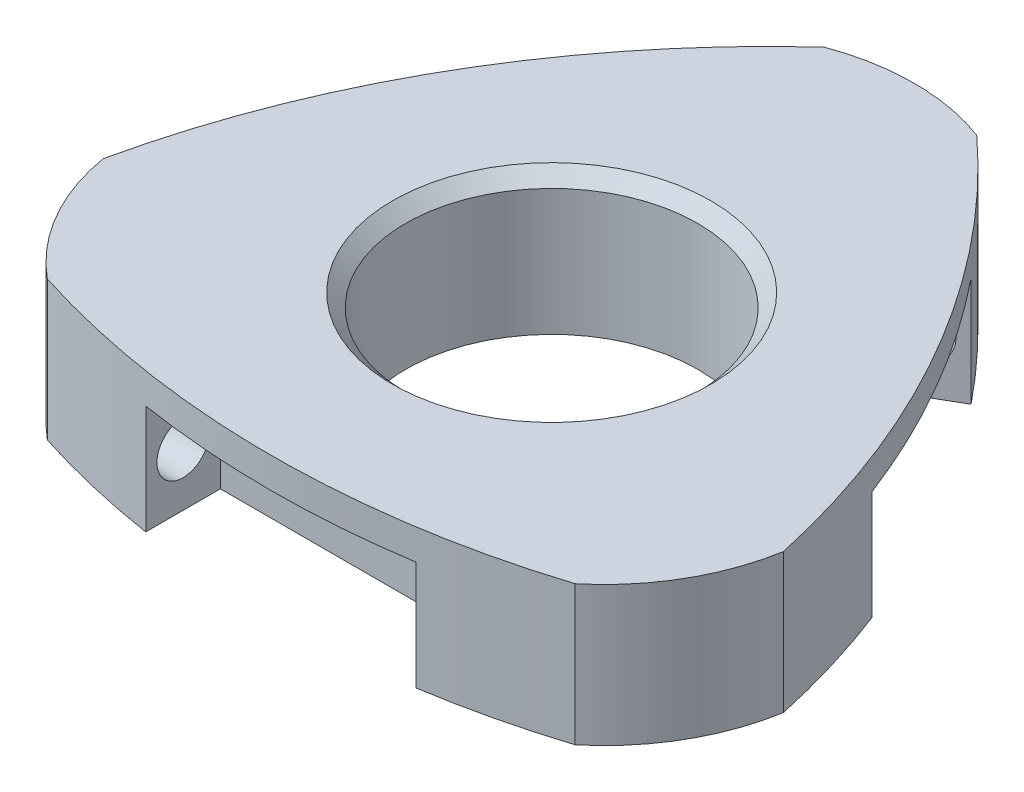
ISO-10303-21;
HEADER;
FILE_DESCRIPTION(('STEP AP214'),'2;1');
FILE_NAME('part.step','',(''),(''),'','','');
FILE_SCHEMA(('AUTOMOTIVE_DESIGN { 1 0 10303 214 1 1 1 1 }'));
ENDSEC;
DATA;
#1=APPLICATION_CONTEXT('core data for automotive mechanical design processes');
#2=APPLICATION_PROTOCOL_DEFINITION('international standard','automotive_design',2000,#1);
#3=PRODUCT_CONTEXT('',#1,'mechanical');
#4=PRODUCT('Part','Part','',(#3));
#5=PRODUCT_RELATED_PRODUCT_CATEGORY('part','',(#4));
#6=PRODUCT_DEFINITION_FORMATION('','',#4);
#7=PRODUCT_DEFINITION_CONTEXT('part definition',#1,'design');
#8=PRODUCT_DEFINITION('design','',#6,#7);
#9=PRODUCT_DEFINITION_SHAPE('','',#8);
#10=(LENGTH_UNIT() NAMED_UNIT(*) SI_UNIT(.MILLI.,.METRE.));
#11=(NAMED_UNIT(*) PLANE_ANGLE_UNIT() SI_UNIT($,.RADIAN.));
#12=(NAMED_UNIT(*) SI_UNIT($,.STERADIAN.) SOLID_ANGLE_UNIT());
#13=UNCERTAINTY_MEASURE_WITH_UNIT(LENGTH_MEASURE(1.E-05),#10,'distance_accuracy_value','');
#14=(GEOMETRIC_REPRESENTATION_CONTEXT(3) GLOBAL_UNCERTAINTY_ASSIGNED_CONTEXT((#13)) GLOBAL_UNIT_ASSIGNED_CONTEXT((#10,
#11,#12)) REPRESENTATION_CONTEXT('',''));
#15=CARTESIAN_POINT('',(0.,0.,0.));
#16=DIRECTION('',(0.,0.,1.));
#17=DIRECTION('',(1.,0.,0.));
#18=AXIS2_PLACEMENT_3D('',#15,#16,#17);
#19=CARTESIAN_POINT('',(-58.6577467048848,32.,17.2848083441158));
#20=DIRECTION('',(0.,-1.,0.));
#21=DIRECTION('',(0.,0.,-1.));
#22=AXIS2_PLACEMENT_3D('',#19,#20,#21);
#23=PLANE('',#22);
#24=CARTESIAN_POINT('',(0.,32.,0.));
#25=DIRECTION('',(0.,-1.,0.));
#26=DIRECTION('',(0.,0.,-1.));
#27=AXIS2_PLACEMENT_3D('',#24,#25,#26);
#28=CIRCLE('',#27,36.5000000000001);
#29=CARTESIAN_POINT('',(0.,32.,-36.5000000000001));
#30=VERTEX_POINT('',#29);
#31=EDGE_CURVE('E294',#30,#30,#28,.T.);
#32=ORIENTED_EDGE('',*,*,#31,.T.);
#33=EDGE_LOOP('',(#32));
#34=FACE_BOUND('',#33,.T.);
#35=CARTESIAN_POINT('',(0.,32.,-33.1625150120123));
#36=DIRECTION('',(0.,1.,0.));
#37=DIRECTION('',(0.,0.,-1.));
#38=AXIS2_PLACEMENT_3D('',#35,#36,#37);
#39=CIRCLE('',#38,49.9999999999997);
#40=CARTESIAN_POINT('',(17.5,32.,-80.));
#41=VERTEX_POINT('',#40);
#42=CARTESIAN_POINT('',(-17.5000000000001,32.,-80.));
#43=VERTEX_POINT('',#42);
#44=EDGE_CURVE('E242',#41,#43,#39,.T.);
#45=ORIENTED_EDGE('',*,*,#44,.T.);
#46=CARTESIAN_POINT('',(117.315493409728,32.,67.7321317002211));
#47=DIRECTION('',(0.,1.,0.));
#48=DIRECTION('',(0.,0.,-1.));
#49=AXIS2_PLACEMENT_3D('',#46,#47,#48);
#50=CIRCLE('',#49,200.);
#51=CARTESIAN_POINT('',(-78.0320323027553,32.,24.8445554337716));
#52=VERTEX_POINT('',#51);
#53=EDGE_CURVE('E245',#43,#52,#50,.T.);
#54=ORIENTED_EDGE('',*,*,#53,.T.);
#55=CARTESIAN_POINT('',(-28.7195804537838,32.,16.5812575060049));
#56=DIRECTION('',(0.,1.,0.));
#57=DIRECTION('',(0.,0.,-1.));
#58=AXIS2_PLACEMENT_3D('',#55,#56,#57);
#59=CIRCLE('',#58,50.0000000000017);
#60=CARTESIAN_POINT('',(-60.5320323027555,32.,55.1554445662271));
#61=VERTEX_POINT('',#60);
#62=EDGE_CURVE('E248',#52,#61,#59,.T.);
#63=ORIENTED_EDGE('',*,*,#62,.T.);
#64=CARTESIAN_POINT('',(9.64996423005846E-13,32.,-135.464263400484));
#65=DIRECTION('',(0.,1.,0.));
#66=DIRECTION('',(0.,0.,-1.));
#67=AXIS2_PLACEMENT_3D('',#64,#65,#66);
#68=CIRCLE('',#67,200.00000000004);
#69=CARTESIAN_POINT('',(60.5320323027548,32.,55.155444566228));
#70=VERTEX_POINT('',#69);
#71=EDGE_CURVE('E250',#61,#70,#68,.T.);
#72=ORIENTED_EDGE('',*,*,#71,.T.);
#73=CARTESIAN_POINT('',(28.7195804537851,32.,16.5812575060061));
#74=DIRECTION('',(0.,1.,0.));
#75=DIRECTION('',(0.,0.,-1.));
#76=AXIS2_PLACEMENT_3D('',#73,#74,#75);
#77=CIRCLE('',#76,50.);
#78=CARTESIAN_POINT('',(78.032032302755,32.,24.8445554337727));
#79=VERTEX_POINT('',#78);
#80=EDGE_CURVE('E252',#70,#79,#77,.T.);
#81=ORIENTED_EDGE('',*,*,#80,.T.);
#82=CARTESIAN_POINT('',(-117.31549340977,32.,67.7321317002439));
#83=DIRECTION('',(0.,1.,0.));
#84=DIRECTION('',(0.,0.,-1.));
#85=AXIS2_PLACEMENT_3D('',#82,#83,#84);
#86=CIRCLE('',#85,200.000000000045);
#87=EDGE_CURVE('E254',#79,#41,#86,.T.);
#88=ORIENTED_EDGE('',*,*,#87,.T.);
#89=EDGE_LOOP('',(#45,#54,#63,#72,#81,#88));
#90=FACE_BOUND('',#89,.T.);
#91=ADVANCED_FACE('F34',(#34,#90),#23,.F.);
#92=CARTESIAN_POINT('',(-58.6577467048848,0.,17.2848083441158));
#93=DIRECTION('',(0.,-1.,0.));
#94=DIRECTION('',(0.,0.,-1.));
#95=AXIS2_PLACEMENT_3D('',#92,#93,#94);
#96=PLANE('',#95);
#97=DIRECTION('',(-0.866025403784436,0.,-0.500000000000004));
#98=VECTOR('',#97,1.);
#99=CARTESIAN_POINT('',(-54.4711431702998,0.,4.34678751731735));
#100=LINE('',#99,#98);
#101=CARTESIAN_POINT('',(-54.4711431702998,0.,4.34678751731735));
#102=VERTEX_POINT('',#101);
#103=CARTESIAN_POINT('',(-69.2963121444177,0.,-4.21252778067141));
#104=VERTEX_POINT('',#103);
#105=EDGE_CURVE('E185',#102,#104,#100,.T.);
#106=ORIENTED_EDGE('',*,*,#105,.F.);
#107=DIRECTION('',(-0.500000000000004,0.,0.866025403784436));
#108=VECTOR('',#107,1.);
#109=CARTESIAN_POINT('',(-23.4711431702995,0.,-49.3467875173177));
#110=LINE('',#109,#108);
#111=CARTESIAN_POINT('',(-23.4711431702995,0.,-49.3467875173177));
#112=VERTEX_POINT('',#111);
#113=EDGE_CURVE('E189',#112,#102,#110,.T.);
#114=ORIENTED_EDGE('',*,*,#113,.F.);
#115=DIRECTION('',(0.866025403784436,0.,0.500000000000004));
#116=VECTOR('',#115,1.);
#117=CARTESIAN_POINT('',(-23.4711431702995,0.,-49.3467875173177));
#118=LINE('',#117,#116);
#119=CARTESIAN_POINT('',(-38.2963121444174,0.,-57.9061028153065));
#120=VERTEX_POINT('',#119);
#121=EDGE_CURVE('E175',#120,#112,#118,.T.);
#122=ORIENTED_EDGE('',*,*,#121,.F.);
#123=CARTESIAN_POINT('',(117.315493409728,0.,67.7321317002211));
#124=DIRECTION('',(0.,1.,0.));
#125=DIRECTION('',(0.,0.,-1.));
#126=AXIS2_PLACEMENT_3D('',#123,#124,#125);
#127=CIRCLE('',#126,200.);
#128=CARTESIAN_POINT('',(-17.5000000000001,0.,-80.));
#129=VERTEX_POINT('',#128);
#130=EDGE_CURVE('E260',#129,#120,#127,.T.);
#131=ORIENTED_EDGE('',*,*,#130,.F.);
#132=CARTESIAN_POINT('',(0.,0.,-33.1625150120123));
#133=DIRECTION('',(0.,1.,0.));
#134=DIRECTION('',(0.,0.,-1.));
#135=AXIS2_PLACEMENT_3D('',#132,#133,#134);
#136=CIRCLE('',#135,49.9999999999997);
#137=CARTESIAN_POINT('',(17.5,0.,-80.));
#138=VERTEX_POINT('',#137);
#139=EDGE_CURVE('E241',#138,#129,#136,.T.);
#140=ORIENTED_EDGE('',*,*,#139,.F.);
#141=CARTESIAN_POINT('',(-117.31549340977,0.,67.7321317002439));
#142=DIRECTION('',(0.,1.,0.));
#143=DIRECTION('',(0.,0.,-1.));
#144=AXIS2_PLACEMENT_3D('',#141,#142,#143);
#145=CIRCLE('',#144,200.000000000045);
#146=CARTESIAN_POINT('',(38.2963121444164,0.,-57.9061028153049));
#147=VERTEX_POINT('',#146);
#148=EDGE_CURVE('E271',#147,#138,#145,.T.);
#149=ORIENTED_EDGE('',*,*,#148,.F.);
#150=DIRECTION('',(0.866025403784443,0.,-0.499999999999992));
#151=VECTOR('',#150,1.);
#152=CARTESIAN_POINT('',(23.4711431703002,0.,-49.3467875173174));
#153=LINE('',#152,#151);
#154=CARTESIAN_POINT('',(23.4711431703002,0.,-49.3467875173174));
#155=VERTEX_POINT('',#154);
#156=EDGE_CURVE('E200',#155,#147,#153,.T.);
#157=ORIENTED_EDGE('',*,*,#156,.F.);
#158=DIRECTION('',(-0.499999999999992,0.,-0.866025403784443));
#159=VECTOR('',#158,1.);
#160=CARTESIAN_POINT('',(54.4711431702997,0.,4.34678751731811));
#161=LINE('',#160,#159);
#162=CARTESIAN_POINT('',(54.4711431702997,0.,4.34678751731811));
#163=VERTEX_POINT('',#162);
#164=EDGE_CURVE('E195',#163,#155,#161,.T.);
#165=ORIENTED_EDGE('',*,*,#164,.F.);
#166=DIRECTION('',(-0.866025403784443,0.,0.499999999999992));
#167=VECTOR('',#166,1.);
#168=CARTESIAN_POINT('',(54.4711431702997,0.,4.34678751731811));
#169=LINE('',#168,#167);
#170=CARTESIAN_POINT('',(69.2963121444162,0.,-4.21252778066954));
#171=VERTEX_POINT('',#170);
#172=EDGE_CURVE('E202',#171,#163,#169,.T.);
#173=ORIENTED_EDGE('',*,*,#172,.F.);
#174=CARTESIAN_POINT('',(78.032032302755,0.,24.8445554337727));
#175=VERTEX_POINT('',#174);
#176=EDGE_CURVE('E246',#175,#171,#145,.T.);
#177=ORIENTED_EDGE('',*,*,#176,.F.);
#178=CARTESIAN_POINT('',(28.7195804537851,0.,16.5812575060061));
#179=DIRECTION('',(0.,1.,0.));
#180=DIRECTION('',(0.,0.,-1.));
#181=AXIS2_PLACEMENT_3D('',#178,#179,#180);
#182=CIRCLE('',#181,50.);
#183=CARTESIAN_POINT('',(60.5320323027548,0.,55.155444566228));
#184=VERTEX_POINT('',#183);
#185=EDGE_CURVE('E269',#184,#175,#182,.T.);
#186=ORIENTED_EDGE('',*,*,#185,.F.);
#187=CARTESIAN_POINT('',(9.64996423005846E-13,0.,-135.464263400484));
#188=DIRECTION('',(0.,1.,0.));
#189=DIRECTION('',(0.,0.,-1.));
#190=AXIS2_PLACEMENT_3D('',#187,#188,#189);
#191=CIRCLE('',#190,200.00000000004);
#192=CARTESIAN_POINT('',(31.,0.,62.1186305959758));
#193=VERTEX_POINT('',#192);
#194=EDGE_CURVE('E265',#193,#184,#191,.T.);
#195=ORIENTED_EDGE('',*,*,#194,.F.);
#196=DIRECTION('',(0.,0.,1.));
#197=VECTOR('',#196,1.);
#198=CARTESIAN_POINT('',(31.,0.,45.));
#199=LINE('',#198,#197);
#200=CARTESIAN_POINT('',(31.,0.,45.));
#201=VERTEX_POINT('',#200);
#202=EDGE_CURVE('E219',#201,#193,#199,.T.);
#203=ORIENTED_EDGE('',*,*,#202,.F.);
#204=DIRECTION('',(1.,0.,0.));
#205=VECTOR('',#204,1.);
#206=CARTESIAN_POINT('',(-31.,0.,45.));
#207=LINE('',#206,#205);
#208=CARTESIAN_POINT('',(-31.,0.,45.));
#209=VERTEX_POINT('',#208);
#210=EDGE_CURVE('E223',#209,#201,#207,.T.);
#211=ORIENTED_EDGE('',*,*,#210,.F.);
#212=DIRECTION('',(0.,0.,-1.));
#213=VECTOR('',#212,1.);
#214=CARTESIAN_POINT('',(-31.,0.,45.));
#215=LINE('',#214,#213);
#216=CARTESIAN_POINT('',(-31.,0.,62.1186305959755));
#217=VERTEX_POINT('',#216);
#218=EDGE_CURVE('E230',#217,#209,#215,.T.);
#219=ORIENTED_EDGE('',*,*,#218,.F.);
#220=CARTESIAN_POINT('',(-60.5320323027555,0.,55.1554445662271));
#221=VERTEX_POINT('',#220);
#222=EDGE_CURVE('E266',#221,#217,#191,.T.);
#223=ORIENTED_EDGE('',*,*,#222,.F.);
#224=CARTESIAN_POINT('',(-28.7195804537838,0.,16.5812575060049));
#225=DIRECTION('',(0.,1.,0.));
#226=DIRECTION('',(0.,0.,-1.));
#227=AXIS2_PLACEMENT_3D('',#224,#225,#226);
#228=CIRCLE('',#227,50.0000000000017);
#229=CARTESIAN_POINT('',(-78.0320323027553,0.,24.8445554337716));
#230=VERTEX_POINT('',#229);
#231=EDGE_CURVE('E263',#230,#221,#228,.T.);
#232=ORIENTED_EDGE('',*,*,#231,.F.);
#233=EDGE_CURVE('E259',#104,#230,#127,.T.);
#234=ORIENTED_EDGE('',*,*,#233,.F.);
#235=EDGE_LOOP('',(#106,#114,#122,#131,#140,#149,#157,#165,#173,#177,#186,#195,#203,#211,#219,
#223,#232,#234));
#236=FACE_BOUND('',#235,.T.);
#237=CARTESIAN_POINT('',(0.,0.,0.));
#238=DIRECTION('',(0.,1.,0.));
#239=DIRECTION('',(0.,0.,1.));
#240=AXIS2_PLACEMENT_3D('',#237,#238,#239);
#241=CIRCLE('',#240,33.5);
#242=CARTESIAN_POINT('',(0.,0.,33.5));
#243=VERTEX_POINT('',#242);
#244=EDGE_CURVE('E236',#243,#243,#241,.T.);
#245=ORIENTED_EDGE('',*,*,#244,.T.);
#246=EDGE_LOOP('',(#245));
#247=FACE_BOUND('',#246,.T.);
#248=ADVANCED_FACE('F365',(#236,#247),#96,.T.);
#249=CARTESIAN_POINT('',(0.,32.,-33.1625150120123));
#250=DIRECTION('',(0.,-1.,0.));
#251=DIRECTION('',(0.,0.,-1.));
#252=AXIS2_PLACEMENT_3D('',#249,#250,#251);
#253=CYLINDRICAL_SURFACE('',#252,49.9999999999997);
#254=ORIENTED_EDGE('',*,*,#139,.T.);
#255=DIRECTION('',(0.,-1.,0.));
#256=VECTOR('',#255,1.);
#257=CARTESIAN_POINT('',(-17.5000000000001,32.,-80.));
#258=LINE('',#257,#256);
#259=EDGE_CURVE('E288',#43,#129,#258,.T.);
#260=ORIENTED_EDGE('',*,*,#259,.F.);
#261=ORIENTED_EDGE('',*,*,#44,.F.);
#262=DIRECTION('',(0.,-1.,0.));
#263=VECTOR('',#262,1.);
#264=CARTESIAN_POINT('',(17.5,32.,-80.));
#265=LINE('',#264,#263);
#266=EDGE_CURVE('E256',#41,#138,#265,.T.);
#267=ORIENTED_EDGE('',*,*,#266,.T.);
#268=EDGE_LOOP('',(#254,#260,#261,#267));
#269=FACE_BOUND('',#268,.T.);
#270=ADVANCED_FACE('F387',(#269),#253,.T.);
#271=CARTESIAN_POINT('',(117.315493409728,32.,67.7321317002211));
#272=DIRECTION('',(0.,-1.,0.));
#273=DIRECTION('',(0.,0.,-1.));
#274=AXIS2_PLACEMENT_3D('',#271,#272,#273);
#275=CYLINDRICAL_SURFACE('',#274,200.);
#276=CARTESIAN_POINT('',(117.315493409728,25.,67.7321317002211));
#277=DIRECTION('',(0.,1.,0.));
#278=DIRECTION('',(0.,0.,1.));
#279=AXIS2_PLACEMENT_3D('',#276,#277,#278);
#280=CIRCLE('',#279,200.);
#281=CARTESIAN_POINT('',(-38.2963121444174,25.,-57.9061028153065));
#282=VERTEX_POINT('',#281);
#283=CARTESIAN_POINT('',(-69.2963121444177,25.,-4.21252778067141));
#284=VERTEX_POINT('',#283);
#285=EDGE_CURVE('E167',#282,#284,#280,.T.);
#286=ORIENTED_EDGE('',*,*,#285,.T.);
#287=DIRECTION('',(0.,-1.,0.));
#288=VECTOR('',#287,1.);
#289=CARTESIAN_POINT('',(-69.2963121444177,32.,-4.21252778067141));
#290=LINE('',#289,#288);
#291=EDGE_CURVE('E11',#284,#104,#290,.T.);
#292=ORIENTED_EDGE('',*,*,#291,.T.);
#293=ORIENTED_EDGE('',*,*,#233,.T.);
#294=DIRECTION('',(0.,-1.,0.));
#295=VECTOR('',#294,1.);
#296=CARTESIAN_POINT('',(-78.0320323027553,32.,24.8445554337716));
#297=LINE('',#296,#295);
#298=EDGE_CURVE('E285',#52,#230,#297,.T.);
#299=ORIENTED_EDGE('',*,*,#298,.F.);
#300=ORIENTED_EDGE('',*,*,#53,.F.);
#301=ORIENTED_EDGE('',*,*,#259,.T.);
#302=ORIENTED_EDGE('',*,*,#130,.T.);
#303=DIRECTION('',(0.,-1.,0.));
#304=VECTOR('',#303,1.);
#305=CARTESIAN_POINT('',(-38.2963121444174,32.,-57.9061028153065));
#306=LINE('',#305,#304);
#307=EDGE_CURVE('E43',#120,#282,#306,.F.);
#308=ORIENTED_EDGE('',*,*,#307,.T.);
#309=EDGE_LOOP('',(#286,#292,#293,#299,#300,#301,#302,#308));
#310=FACE_BOUND('',#309,.T.);
#311=ADVANCED_FACE('F407',(#310),#275,.T.);
#312=CARTESIAN_POINT('',(-28.7195804537838,32.,16.5812575060049));
#313=DIRECTION('',(0.,-1.,0.));
#314=DIRECTION('',(0.,0.,-1.));
#315=AXIS2_PLACEMENT_3D('',#312,#313,#314);
#316=CYLINDRICAL_SURFACE('',#315,50.0000000000017);
#317=ORIENTED_EDGE('',*,*,#231,.T.);
#318=DIRECTION('',(0.,-1.,0.));
#319=VECTOR('',#318,1.);
#320=CARTESIAN_POINT('',(-60.5320323027555,32.,55.1554445662271));
#321=LINE('',#320,#319);
#322=EDGE_CURVE('E282',#61,#221,#321,.T.);
#323=ORIENTED_EDGE('',*,*,#322,.F.);
#324=ORIENTED_EDGE('',*,*,#62,.F.);
#325=ORIENTED_EDGE('',*,*,#298,.T.);
#326=EDGE_LOOP('',(#317,#323,#324,#325));
#327=FACE_BOUND('',#326,.T.);
#328=ADVANCED_FACE('F403',(#327),#316,.T.);
#329=CARTESIAN_POINT('',(9.64996423005846E-13,32.,-135.464263400484));
#330=DIRECTION('',(0.,-1.,0.));
#331=DIRECTION('',(0.,0.,-1.));
#332=AXIS2_PLACEMENT_3D('',#329,#330,#331);
#333=CYLINDRICAL_SURFACE('',#332,200.00000000004);
#334=CARTESIAN_POINT('',(9.64996423005846E-13,25.,-135.464263400484));
#335=DIRECTION('',(0.,1.,0.));
#336=DIRECTION('',(0.,0.,1.));
#337=AXIS2_PLACEMENT_3D('',#334,#335,#336);
#338=CIRCLE('',#337,200.00000000004);
#339=CARTESIAN_POINT('',(-31.,25.,62.1186305959755));
#340=VERTEX_POINT('',#339);
#341=CARTESIAN_POINT('',(31.,25.,62.1186305959758));
#342=VERTEX_POINT('',#341);
#343=EDGE_CURVE('E297',#340,#342,#338,.T.);
#344=ORIENTED_EDGE('',*,*,#343,.T.);
#345=DIRECTION('',(0.,-1.,0.));
#346=VECTOR('',#345,1.);
#347=CARTESIAN_POINT('',(31.,32.,62.1186305959758));
#348=LINE('',#347,#346);
#349=EDGE_CURVE('E303',#342,#193,#348,.T.);
#350=ORIENTED_EDGE('',*,*,#349,.T.);
#351=ORIENTED_EDGE('',*,*,#194,.T.);
#352=DIRECTION('',(0.,-1.,0.));
#353=VECTOR('',#352,1.);
#354=CARTESIAN_POINT('',(60.5320323027548,32.,55.155444566228));
#355=LINE('',#354,#353);
#356=EDGE_CURVE('E279',#70,#184,#355,.T.);
#357=ORIENTED_EDGE('',*,*,#356,.F.);
#358=ORIENTED_EDGE('',*,*,#71,.F.);
#359=ORIENTED_EDGE('',*,*,#322,.T.);
#360=ORIENTED_EDGE('',*,*,#222,.T.);
#361=DIRECTION('',(0.,-1.,0.));
#362=VECTOR('',#361,1.);
#363=CARTESIAN_POINT('',(-31.,32.,62.1186305959755));
#364=LINE('',#363,#362);
#365=EDGE_CURVE('E300',#217,#340,#364,.F.);
#366=ORIENTED_EDGE('',*,*,#365,.T.);
#367=EDGE_LOOP('',(#344,#350,#351,#357,#358,#359,#360,#366));
#368=FACE_BOUND('',#367,.T.);
#369=ADVANCED_FACE('F399',(#368),#333,.T.);
#370=CARTESIAN_POINT('',(28.7195804537851,32.,16.5812575060061));
#371=DIRECTION('',(0.,-1.,0.));
#372=DIRECTION('',(0.,0.,-1.));
#373=AXIS2_PLACEMENT_3D('',#370,#371,#372);
#374=CYLINDRICAL_SURFACE('',#373,50.);
#375=ORIENTED_EDGE('',*,*,#185,.T.);
#376=DIRECTION('',(0.,-1.,0.));
#377=VECTOR('',#376,1.);
#378=CARTESIAN_POINT('',(78.032032302755,32.,24.8445554337727));
#379=LINE('',#378,#377);
#380=EDGE_CURVE('E276',#79,#175,#379,.T.);
#381=ORIENTED_EDGE('',*,*,#380,.F.);
#382=ORIENTED_EDGE('',*,*,#80,.F.);
#383=ORIENTED_EDGE('',*,*,#356,.T.);
#384=EDGE_LOOP('',(#375,#381,#382,#383));
#385=FACE_BOUND('',#384,.T.);
#386=ADVANCED_FACE('F396',(#385),#374,.T.);
#387=CARTESIAN_POINT('',(-117.31549340977,32.,67.7321317002439));
#388=DIRECTION('',(0.,-1.,0.));
#389=DIRECTION('',(0.,0.,-1.));
#390=AXIS2_PLACEMENT_3D('',#387,#388,#389);
#391=CYLINDRICAL_SURFACE('',#390,200.000000000045);
#392=CARTESIAN_POINT('',(-117.31549340977,25.,67.7321317002439));
#393=DIRECTION('',(0.,1.,0.));
#394=DIRECTION('',(0.,0.,1.));
#395=AXIS2_PLACEMENT_3D('',#392,#393,#394);
#396=CIRCLE('',#395,200.000000000045);
#397=CARTESIAN_POINT('',(69.2963121444162,25.,-4.21252778066954));
#398=VERTEX_POINT('',#397);
#399=CARTESIAN_POINT('',(38.2963121444164,25.,-57.9061028153049));
#400=VERTEX_POINT('',#399);
#401=EDGE_CURVE('E306',#398,#400,#396,.T.);
#402=ORIENTED_EDGE('',*,*,#401,.T.);
#403=DIRECTION('',(0.,-1.,0.));
#404=VECTOR('',#403,1.);
#405=CARTESIAN_POINT('',(38.2963121444164,32.,-57.9061028153049));
#406=LINE('',#405,#404);
#407=EDGE_CURVE('E314',#400,#147,#406,.T.);
#408=ORIENTED_EDGE('',*,*,#407,.T.);
#409=ORIENTED_EDGE('',*,*,#148,.T.);
#410=ORIENTED_EDGE('',*,*,#266,.F.);
#411=ORIENTED_EDGE('',*,*,#87,.F.);
#412=ORIENTED_EDGE('',*,*,#380,.T.);
#413=ORIENTED_EDGE('',*,*,#176,.T.);
#414=DIRECTION('',(0.,-1.,0.));
#415=VECTOR('',#414,1.);
#416=CARTESIAN_POINT('',(69.2963121444162,32.,-4.21252778066955));
#417=LINE('',#416,#415);
#418=EDGE_CURVE('E311',#171,#398,#417,.F.);
#419=ORIENTED_EDGE('',*,*,#418,.T.);
#420=EDGE_LOOP('',(#402,#408,#409,#410,#411,#412,#413,#419));
#421=FACE_BOUND('',#420,.T.);
#422=ADVANCED_FACE('F371',(#421),#391,.T.);
#423=CARTESIAN_POINT('',(0.,32.,0.));
#424=DIRECTION('',(0.,-1.,0.));
#425=DIRECTION('',(0.,0.,-1.));
#426=AXIS2_PLACEMENT_3D('',#423,#424,#425);
#427=CYLINDRICAL_SURFACE('',#426,33.5);
#428=CARTESIAN_POINT('',(0.,28.9999999999999,0.));
#429=DIRECTION('',(0.,-1.,0.));
#430=DIRECTION('',(0.,0.,-1.));
#431=AXIS2_PLACEMENT_3D('',#428,#429,#430);
#432=CIRCLE('',#431,33.5);
#433=CARTESIAN_POINT('',(0.,28.9999999999999,-33.5));
#434=VERTEX_POINT('',#433);
#435=EDGE_CURVE('E291',#434,#434,#432,.F.);
#436=ORIENTED_EDGE('',*,*,#435,.T.);
#437=EDGE_LOOP('',(#436));
#438=FACE_BOUND('',#437,.T.);
#439=ORIENTED_EDGE('',*,*,#244,.F.);
#440=EDGE_LOOP('',(#439));
#441=FACE_BOUND('',#440,.T.);
#442=ADVANCED_FACE('F391',(#438,#441),#427,.F.);
#443=CARTESIAN_POINT('',(0.,28.9999999999999,0.));
#444=DIRECTION('',(0.,1.,0.));
#445=DIRECTION('',(0.,0.,1.));
#446=AXIS2_PLACEMENT_3D('',#443,#444,#445);
#447=CONICAL_SURFACE('',#446,33.5,0.785398163397453);
#448=ORIENTED_EDGE('',*,*,#31,.F.);
#449=EDGE_LOOP('',(#448));
#450=FACE_BOUND('',#449,.T.);
#451=ORIENTED_EDGE('',*,*,#435,.F.);
#452=EDGE_LOOP('',(#451));
#453=FACE_BOUND('',#452,.T.);
#454=ADVANCED_FACE('F36',(#450,#453),#447,.F.);
#455=CARTESIAN_POINT('',(31.,25.,45.));
#456=DIRECTION('',(1.,0.,0.));
#457=DIRECTION('',(0.,0.,-1.));
#458=AXIS2_PLACEMENT_3D('',#455,#456,#457);
#459=PLANE('',#458);
#460=CARTESIAN_POINT('',(31.,12.5,53.5593152979879));
#461=DIRECTION('',(1.,0.,0.));
#462=DIRECTION('',(0.,0.,-1.));
#463=AXIS2_PLACEMENT_3D('',#460,#461,#462);
#464=CIRCLE('',#463,5.99999999999999);
#465=CARTESIAN_POINT('',(31.,12.5,47.5593152979879));
#466=VERTEX_POINT('',#465);
#467=EDGE_CURVE('E216',#466,#466,#464,.F.);
#468=ORIENTED_EDGE('',*,*,#467,.F.);
#469=EDGE_LOOP('',(#468));
#470=FACE_BOUND('',#469,.T.);
#471=DIRECTION('',(0.,0.,1.));
#472=VECTOR('',#471,1.);
#473=CARTESIAN_POINT('',(31.,25.,45.));
#474=LINE('',#473,#472);
#475=CARTESIAN_POINT('',(31.,25.,45.));
#476=VERTEX_POINT('',#475);
#477=EDGE_CURVE('E220',#476,#342,#474,.T.);
#478=ORIENTED_EDGE('',*,*,#477,.F.);
#479=DIRECTION('',(0.,-1.,0.));
#480=VECTOR('',#479,1.);
#481=CARTESIAN_POINT('',(31.,25.,45.));
#482=LINE('',#481,#480);
#483=EDGE_CURVE('E234',#476,#201,#482,.T.);
#484=ORIENTED_EDGE('',*,*,#483,.T.);
#485=ORIENTED_EDGE('',*,*,#202,.T.);
#486=ORIENTED_EDGE('',*,*,#349,.F.);
#487=EDGE_LOOP('',(#478,#484,#485,#486));
#488=FACE_BOUND('',#487,.T.);
#489=ADVANCED_FACE('F430',(#470,#488),#459,.F.);
#490=CARTESIAN_POINT('',(-31.,25.,45.));
#491=DIRECTION('',(-1.,0.,0.));
#492=DIRECTION('',(0.,0.,1.));
#493=AXIS2_PLACEMENT_3D('',#490,#491,#492);
#494=PLANE('',#493);
#495=CARTESIAN_POINT('',(-31.,12.5,53.5593152979879));
#496=DIRECTION('',(-1.,0.,0.));
#497=DIRECTION('',(0.,0.,1.));
#498=AXIS2_PLACEMENT_3D('',#495,#496,#497);
#499=CIRCLE('',#498,5.99999999999999);
#500=CARTESIAN_POINT('',(-31.,12.5,59.5593152979879));
#501=VERTEX_POINT('',#500);
#502=EDGE_CURVE('E215',#501,#501,#499,.F.);
#503=ORIENTED_EDGE('',*,*,#502,.F.);
#504=EDGE_LOOP('',(#503));
#505=FACE_BOUND('',#504,.T.);
#506=ORIENTED_EDGE('',*,*,#218,.T.);
#507=DIRECTION('',(0.,-1.,0.));
#508=VECTOR('',#507,1.);
#509=CARTESIAN_POINT('',(-31.,25.,45.));
#510=LINE('',#509,#508);
#511=CARTESIAN_POINT('',(-31.,25.,45.));
#512=VERTEX_POINT('',#511);
#513=EDGE_CURVE('E228',#512,#209,#510,.T.);
#514=ORIENTED_EDGE('',*,*,#513,.F.);
#515=DIRECTION('',(0.,0.,-1.));
#516=VECTOR('',#515,1.);
#517=CARTESIAN_POINT('',(-31.,25.,45.));
#518=LINE('',#517,#516);
#519=EDGE_CURVE('E222',#340,#512,#518,.T.);
#520=ORIENTED_EDGE('',*,*,#519,.F.);
#521=ORIENTED_EDGE('',*,*,#365,.F.);
#522=EDGE_LOOP('',(#506,#514,#520,#521));
#523=FACE_BOUND('',#522,.T.);
#524=ADVANCED_FACE('F440',(#505,#523),#494,.F.);
#525=CARTESIAN_POINT('',(0.,25.,0.));
#526=DIRECTION('',(0.,1.,0.));
#527=DIRECTION('',(0.,0.,1.));
#528=AXIS2_PLACEMENT_3D('',#525,#526,#527);
#529=PLANE('',#528);
#530=ORIENTED_EDGE('',*,*,#519,.T.);
#531=DIRECTION('',(1.,0.,0.));
#532=VECTOR('',#531,1.);
#533=CARTESIAN_POINT('',(-31.,25.,45.));
#534=LINE('',#533,#532);
#535=EDGE_CURVE('E225',#512,#476,#534,.T.);
#536=ORIENTED_EDGE('',*,*,#535,.T.);
#537=ORIENTED_EDGE('',*,*,#477,.T.);
#538=ORIENTED_EDGE('',*,*,#343,.F.);
#539=EDGE_LOOP('',(#530,#536,#537,#538));
#540=FACE_BOUND('',#539,.T.);
#541=ADVANCED_FACE('F619',(#540),#529,.F.);
#542=CARTESIAN_POINT('',(-31.,25.,45.));
#543=DIRECTION('',(0.,0.,-1.));
#544=DIRECTION('',(-1.,0.,0.));
#545=AXIS2_PLACEMENT_3D('',#542,#543,#544);
#546=PLANE('',#545);
#547=ORIENTED_EDGE('',*,*,#210,.T.);
#548=ORIENTED_EDGE('',*,*,#483,.F.);
#549=ORIENTED_EDGE('',*,*,#535,.F.);
#550=ORIENTED_EDGE('',*,*,#513,.T.);
#551=EDGE_LOOP('',(#547,#548,#549,#550));
#552=FACE_BOUND('',#551,.T.);
#553=ADVANCED_FACE('F435',(#552),#546,.F.);
#554=CARTESIAN_POINT('',(-40.,12.5,53.5593152979879));
#555=DIRECTION('',(1.,0.,0.));
#556=DIRECTION('',(0.,0.,-1.));
#557=AXIS2_PLACEMENT_3D('',#554,#555,#556);
#558=PLANE('',#557);
#559=CARTESIAN_POINT('',(-40.,12.5,53.5593152979879));
#560=DIRECTION('',(1.,0.,0.));
#561=DIRECTION('',(0.,0.,-1.));
#562=AXIS2_PLACEMENT_3D('',#559,#560,#561);
#563=CIRCLE('',#562,5.99999999999999);
#564=CARTESIAN_POINT('',(-40.,12.5,47.5593152979879));
#565=VERTEX_POINT('',#564);
#566=EDGE_CURVE('E191',#565,#565,#563,.T.);
#567=ORIENTED_EDGE('',*,*,#566,.T.);
#568=EDGE_LOOP('',(#567));
#569=FACE_BOUND('',#568,.T.);
#570=ADVANCED_FACE('F602',(#569),#558,.T.);
#571=CARTESIAN_POINT('',(40.,12.5,53.5593152979879));
#572=DIRECTION('',(-1.,0.,0.));
#573=DIRECTION('',(0.,0.,1.));
#574=AXIS2_PLACEMENT_3D('',#571,#572,#573);
#575=CYLINDRICAL_SURFACE('',#574,5.99999999999999);
#576=ORIENTED_EDGE('',*,*,#566,.F.);
#577=EDGE_LOOP('',(#576));
#578=FACE_BOUND('',#577,.T.);
#579=ORIENTED_EDGE('',*,*,#502,.T.);
#580=EDGE_LOOP('',(#579));
#581=FACE_BOUND('',#580,.T.);
#582=ADVANCED_FACE('F593',(#578,#581),#575,.F.);
#583=CARTESIAN_POINT('',(40.,12.5,53.5593152979879));
#584=DIRECTION('',(1.,0.,0.));
#585=DIRECTION('',(0.,0.,-1.));
#586=AXIS2_PLACEMENT_3D('',#583,#584,#585);
#587=CIRCLE('',#586,5.99999999999999);
#588=CARTESIAN_POINT('',(40.,12.5,47.5593152979879));
#589=VERTEX_POINT('',#588);
#590=EDGE_CURVE('E212',#589,#589,#587,.T.);
#591=ORIENTED_EDGE('',*,*,#590,.T.);
#592=EDGE_LOOP('',(#591));
#593=FACE_BOUND('',#592,.T.);
#594=ORIENTED_EDGE('',*,*,#467,.T.);
#595=EDGE_LOOP('',(#594));
#596=FACE_BOUND('',#595,.T.);
#597=ADVANCED_FACE('F583',(#593,#596),#575,.F.);
#598=CARTESIAN_POINT('',(40.,12.5,53.5593152979879));
#599=DIRECTION('',(1.,0.,0.));
#600=DIRECTION('',(0.,0.,-1.));
#601=AXIS2_PLACEMENT_3D('',#598,#599,#600);
#602=PLANE('',#601);
#603=ORIENTED_EDGE('',*,*,#590,.F.);
#604=EDGE_LOOP('',(#603));
#605=FACE_BOUND('',#604,.T.);
#606=ADVANCED_FACE('F573',(#605),#602,.F.);
#607=CARTESIAN_POINT('',(23.4711431703002,25.,-49.3467875173174));
#608=DIRECTION('',(-0.499999999999992,0.,-0.866025403784443));
#609=DIRECTION('',(-0.866025403784443,0.,0.499999999999992));
#610=AXIS2_PLACEMENT_3D('',#607,#608,#609);
#611=PLANE('',#610);
#612=CARTESIAN_POINT('',(30.8837276573585,12.5,-53.6264451663112));
#613=DIRECTION('',(-0.499999999999992,0.,-0.866025403784443));
#614=DIRECTION('',(-0.866025403784443,0.,0.499999999999992));
#615=AXIS2_PLACEMENT_3D('',#612,#613,#614);
#616=CIRCLE('',#615,5.99999999999999);
#617=CARTESIAN_POINT('',(25.6875752346519,12.5,-50.6264451663113));
#618=VERTEX_POINT('',#617);
#619=EDGE_CURVE('E203',#618,#618,#616,.F.);
#620=ORIENTED_EDGE('',*,*,#619,.F.);
#621=EDGE_LOOP('',(#620));
#622=FACE_BOUND('',#621,.T.);
#623=DIRECTION('',(0.866025403784443,0.,-0.499999999999992));
#624=VECTOR('',#623,1.);
#625=CARTESIAN_POINT('',(23.4711431703002,25.,-49.3467875173174));
#626=LINE('',#625,#624);
#627=CARTESIAN_POINT('',(23.4711431703002,25.,-49.3467875173174));
#628=VERTEX_POINT('',#627);
#629=EDGE_CURVE('E59',#628,#400,#626,.T.);
#630=ORIENTED_EDGE('',*,*,#629,.F.);
#631=DIRECTION('',(0.,-1.,0.));
#632=VECTOR('',#631,1.);
#633=CARTESIAN_POINT('',(23.4711431703002,25.,-49.3467875173174));
#634=LINE('',#633,#632);
#635=EDGE_CURVE('E187',#628,#155,#634,.T.);
#636=ORIENTED_EDGE('',*,*,#635,.T.);
#637=ORIENTED_EDGE('',*,*,#156,.T.);
#638=ORIENTED_EDGE('',*,*,#407,.F.);
#639=EDGE_LOOP('',(#630,#636,#637,#638));
#640=FACE_BOUND('',#639,.T.);
#641=ADVANCED_FACE('F352',(#622,#640),#611,.F.);
#642=CARTESIAN_POINT('',(54.4711431702997,25.,4.34678751731811));
#643=DIRECTION('',(0.499999999999992,0.,0.866025403784443));
#644=DIRECTION('',(0.866025403784443,0.,-0.499999999999992));
#645=AXIS2_PLACEMENT_3D('',#642,#643,#644);
#646=PLANE('',#645);
#647=CARTESIAN_POINT('',(61.883727657358,12.5,0.067129868324238));
#648=DIRECTION('',(0.499999999999992,0.,0.866025403784443));
#649=DIRECTION('',(0.866025403784443,0.,-0.499999999999992));
#650=AXIS2_PLACEMENT_3D('',#647,#648,#649);
#651=CIRCLE('',#650,5.99999999999999);
#652=CARTESIAN_POINT('',(67.0798800800647,12.5,-2.93287013167571));
#653=VERTEX_POINT('',#652);
#654=EDGE_CURVE('E38',#653,#653,#651,.F.);
#655=ORIENTED_EDGE('',*,*,#654,.F.);
#656=EDGE_LOOP('',(#655));
#657=FACE_BOUND('',#656,.T.);
#658=ORIENTED_EDGE('',*,*,#172,.T.);
#659=DIRECTION('',(0.,-1.,0.));
#660=VECTOR('',#659,1.);
#661=CARTESIAN_POINT('',(54.4711431702997,25.,4.34678751731811));
#662=LINE('',#661,#660);
#663=CARTESIAN_POINT('',(54.4711431702997,25.,4.34678751731811));
#664=VERTEX_POINT('',#663);
#665=EDGE_CURVE('E199',#664,#163,#662,.T.);
#666=ORIENTED_EDGE('',*,*,#665,.F.);
#667=DIRECTION('',(-0.866025403784443,0.,0.499999999999992));
#668=VECTOR('',#667,1.);
#669=CARTESIAN_POINT('',(54.4711431702997,25.,4.34678751731811));
#670=LINE('',#669,#668);
#671=EDGE_CURVE('E194',#398,#664,#670,.T.);
#672=ORIENTED_EDGE('',*,*,#671,.F.);
#673=ORIENTED_EDGE('',*,*,#418,.F.);
#674=EDGE_LOOP('',(#658,#666,#672,#673));
#675=FACE_BOUND('',#674,.T.);
#676=ADVANCED_FACE('F348',(#657,#675),#646,.F.);
#677=CARTESIAN_POINT('',(0.,25.,0.));
#678=DIRECTION('',(0.,1.,0.));
#679=DIRECTION('',(0.866025403784443,0.,-0.499999999999992));
#680=AXIS2_PLACEMENT_3D('',#677,#678,#679);
#681=PLANE('',#680);
#682=ORIENTED_EDGE('',*,*,#671,.T.);
#683=DIRECTION('',(-0.499999999999992,0.,-0.866025403784443));
#684=VECTOR('',#683,1.);
#685=CARTESIAN_POINT('',(54.4711431702997,25.,4.34678751731811));
#686=LINE('',#685,#684);
#687=EDGE_CURVE('E197',#664,#628,#686,.T.);
#688=ORIENTED_EDGE('',*,*,#687,.T.);
#689=ORIENTED_EDGE('',*,*,#629,.T.);
#690=ORIENTED_EDGE('',*,*,#401,.F.);
#691=EDGE_LOOP('',(#682,#688,#689,#690));
#692=FACE_BOUND('',#691,.T.);
#693=ADVANCED_FACE('F351',(#692),#681,.F.);
#694=CARTESIAN_POINT('',(54.4711431702997,25.,4.34678751731811));
#695=DIRECTION('',(-0.866025403784443,0.,0.499999999999992));
#696=DIRECTION('',(0.499999999999992,0.,0.866025403784443));
#697=AXIS2_PLACEMENT_3D('',#694,#695,#696);
#698=PLANE('',#697);
#699=ORIENTED_EDGE('',*,*,#164,.T.);
#700=ORIENTED_EDGE('',*,*,#635,.F.);
#701=ORIENTED_EDGE('',*,*,#687,.F.);
#702=ORIENTED_EDGE('',*,*,#665,.T.);
#703=EDGE_LOOP('',(#699,#700,#701,#702));
#704=FACE_BOUND('',#703,.T.);
#705=ADVANCED_FACE('F362',(#704),#698,.F.);
#706=CARTESIAN_POINT('',(-54.4711431702998,25.,4.34678751731735));
#707=DIRECTION('',(-0.500000000000004,0.,0.866025403784436));
#708=DIRECTION('',(0.866025403784436,0.,0.500000000000004));
#709=AXIS2_PLACEMENT_3D('',#706,#707,#708);
#710=PLANE('',#709);
#711=CARTESIAN_POINT('',(-61.883727657358,12.5,0.0671298683233741));
#712=DIRECTION('',(-0.500000000000004,0.,0.866025403784436));
#713=DIRECTION('',(0.866025403784436,0.,0.500000000000004));
#714=AXIS2_PLACEMENT_3D('',#711,#712,#713);
#715=CIRCLE('',#714,5.99999999999999);
#716=CARTESIAN_POINT('',(-56.6875752346514,12.5,3.06712986832339));
#717=VERTEX_POINT('',#716);
#718=EDGE_CURVE('E320',#717,#717,#715,.F.);
#719=ORIENTED_EDGE('',*,*,#718,.F.);
#720=EDGE_LOOP('',(#719));
#721=FACE_BOUND('',#720,.T.);
#722=DIRECTION('',(-0.866025403784436,0.,-0.500000000000004));
#723=VECTOR('',#722,1.);
#724=CARTESIAN_POINT('',(-54.4711431702998,25.,4.34678751731735));
#725=LINE('',#724,#723);
#726=CARTESIAN_POINT('',(-54.4711431702998,25.,4.34678751731735));
#727=VERTEX_POINT('',#726);
#728=EDGE_CURVE('E51',#727,#284,#725,.T.);
#729=ORIENTED_EDGE('',*,*,#728,.F.);
#730=DIRECTION('',(0.,-1.,0.));
#731=VECTOR('',#730,1.);
#732=CARTESIAN_POINT('',(-54.4711431702998,25.,4.34678751731735));
#733=LINE('',#732,#731);
#734=EDGE_CURVE('E179',#727,#102,#733,.T.);
#735=ORIENTED_EDGE('',*,*,#734,.T.);
#736=ORIENTED_EDGE('',*,*,#105,.T.);
#737=ORIENTED_EDGE('',*,*,#291,.F.);
#738=EDGE_LOOP('',(#729,#735,#736,#737));
#739=FACE_BOUND('',#738,.T.);
#740=ADVANCED_FACE('F378',(#721,#739),#710,.F.);
#741=CARTESIAN_POINT('',(-23.4711431702995,25.,-49.3467875173177));
#742=DIRECTION('',(0.500000000000004,0.,-0.866025403784436));
#743=DIRECTION('',(-0.866025403784436,0.,-0.500000000000004));
#744=AXIS2_PLACEMENT_3D('',#741,#742,#743);
#745=PLANE('',#744);
#746=CARTESIAN_POINT('',(-30.8837276573578,12.5,-53.6264451663117));
#747=DIRECTION('',(0.500000000000004,0.,-0.866025403784436));
#748=DIRECTION('',(-0.866025403784436,0.,-0.500000000000004));
#749=AXIS2_PLACEMENT_3D('',#746,#747,#748);
#750=CIRCLE('',#749,5.99999999999999);
#751=CARTESIAN_POINT('',(-36.0798800800644,12.5,-56.6264451663117));
#752=VERTEX_POINT('',#751);
#753=EDGE_CURVE('E318',#752,#752,#750,.F.);
#754=ORIENTED_EDGE('',*,*,#753,.F.);
#755=EDGE_LOOP('',(#754));
#756=FACE_BOUND('',#755,.T.);
#757=ORIENTED_EDGE('',*,*,#121,.T.);
#758=DIRECTION('',(0.,-1.,0.));
#759=VECTOR('',#758,1.);
#760=CARTESIAN_POINT('',(-23.4711431702995,25.,-49.3467875173177));
#761=LINE('',#760,#759);
#762=CARTESIAN_POINT('',(-23.4711431702995,25.,-49.3467875173177));
#763=VERTEX_POINT('',#762);
#764=EDGE_CURVE('E172',#763,#112,#761,.T.);
#765=ORIENTED_EDGE('',*,*,#764,.F.);
#766=DIRECTION('',(0.866025403784436,0.,0.500000000000004));
#767=VECTOR('',#766,1.);
#768=CARTESIAN_POINT('',(-23.4711431702995,25.,-49.3467875173177));
#769=LINE('',#768,#767);
#770=EDGE_CURVE('E161',#282,#763,#769,.T.);
#771=ORIENTED_EDGE('',*,*,#770,.F.);
#772=ORIENTED_EDGE('',*,*,#307,.F.);
#773=EDGE_LOOP('',(#757,#765,#771,#772));
#774=FACE_BOUND('',#773,.T.);
#775=ADVANCED_FACE('F173',(#756,#774),#745,.F.);
#776=CARTESIAN_POINT('',(0.,25.,0.));
#777=DIRECTION('',(0.,1.,0.));
#778=DIRECTION('',(-0.866025403784436,0.,-0.500000000000004));
#779=AXIS2_PLACEMENT_3D('',#776,#777,#778);
#780=PLANE('',#779);
#781=ORIENTED_EDGE('',*,*,#770,.T.);
#782=DIRECTION('',(-0.500000000000004,0.,0.866025403784436));
#783=VECTOR('',#782,1.);
#784=CARTESIAN_POINT('',(-23.4711431702995,25.,-49.3467875173177));
#785=LINE('',#784,#783);
#786=EDGE_CURVE('E165',#763,#727,#785,.T.);
#787=ORIENTED_EDGE('',*,*,#786,.T.);
#788=ORIENTED_EDGE('',*,*,#728,.T.);
#789=ORIENTED_EDGE('',*,*,#285,.F.);
#790=EDGE_LOOP('',(#781,#787,#788,#789));
#791=FACE_BOUND('',#790,.T.);
#792=ADVANCED_FACE('F163',(#791),#780,.F.);
#793=CARTESIAN_POINT('',(-23.4711431702995,25.,-49.3467875173177));
#794=DIRECTION('',(0.866025403784436,0.,0.500000000000004));
#795=DIRECTION('',(0.500000000000004,0.,-0.866025403784436));
#796=AXIS2_PLACEMENT_3D('',#793,#794,#795);
#797=PLANE('',#796);
#798=ORIENTED_EDGE('',*,*,#113,.T.);
#799=ORIENTED_EDGE('',*,*,#734,.F.);
#800=ORIENTED_EDGE('',*,*,#786,.F.);
#801=ORIENTED_EDGE('',*,*,#764,.T.);
#802=EDGE_LOOP('',(#798,#799,#800,#801));
#803=FACE_BOUND('',#802,.T.);
#804=ADVANCED_FACE('F181',(#803),#797,.F.);
#805=CARTESIAN_POINT('',(-26.3837276573577,12.5,-61.4206738003716));
#806=DIRECTION('',(-0.500000000000004,0.,0.866025403784436));
#807=DIRECTION('',(0.866025403784436,0.,0.500000000000004));
#808=AXIS2_PLACEMENT_3D('',#805,#806,#807);
#809=PLANE('',#808);
#810=CARTESIAN_POINT('',(-26.3837276573577,12.5,-61.4206738003716));
#811=DIRECTION('',(-0.500000000000004,0.,0.866025403784436));
#812=DIRECTION('',(0.866025403784436,0.,0.500000000000004));
#813=AXIS2_PLACEMENT_3D('',#810,#811,#812);
#814=CIRCLE('',#813,5.99999999999999);
#815=CARTESIAN_POINT('',(-21.1875752346511,12.5,-58.4206738003716));
#816=VERTEX_POINT('',#815);
#817=EDGE_CURVE('E327',#816,#816,#814,.T.);
#818=ORIENTED_EDGE('',*,*,#817,.T.);
#819=EDGE_LOOP('',(#818));
#820=FACE_BOUND('',#819,.T.);
#821=ADVANCED_FACE('F456',(#820),#809,.T.);
#822=CARTESIAN_POINT('',(-66.3837276573581,12.5,7.86135850238331));
#823=DIRECTION('',(0.500000000000004,0.,-0.866025403784436));
#824=DIRECTION('',(-0.866025403784436,0.,-0.500000000000004));
#825=AXIS2_PLACEMENT_3D('',#822,#823,#824);
#826=CYLINDRICAL_SURFACE('',#825,5.99999999999999);
#827=ORIENTED_EDGE('',*,*,#817,.F.);
#828=EDGE_LOOP('',(#827));
#829=FACE_BOUND('',#828,.T.);
#830=ORIENTED_EDGE('',*,*,#753,.T.);
#831=EDGE_LOOP('',(#830));
#832=FACE_BOUND('',#831,.T.);
#833=ADVANCED_FACE('F475',(#829,#832),#826,.F.);
#834=CARTESIAN_POINT('',(-66.3837276573581,12.5,7.86135850238331));
#835=DIRECTION('',(-0.500000000000004,0.,0.866025403784436));
#836=DIRECTION('',(0.866025403784436,0.,0.500000000000004));
#837=AXIS2_PLACEMENT_3D('',#834,#835,#836);
#838=CIRCLE('',#837,5.99999999999999);
#839=CARTESIAN_POINT('',(-61.1875752346515,12.5,10.8613585023833));
#840=VERTEX_POINT('',#839);
#841=EDGE_CURVE('E321',#840,#840,#838,.T.);
#842=ORIENTED_EDGE('',*,*,#841,.T.);
#843=EDGE_LOOP('',(#842));
#844=FACE_BOUND('',#843,.T.);
#845=ORIENTED_EDGE('',*,*,#718,.T.);
#846=EDGE_LOOP('',(#845));
#847=FACE_BOUND('',#846,.T.);
#848=ADVANCED_FACE('F472',(#844,#847),#826,.F.);
#849=CARTESIAN_POINT('',(-66.3837276573581,12.5,7.86135850238331));
#850=DIRECTION('',(-0.500000000000004,0.,0.866025403784436));
#851=DIRECTION('',(0.866025403784436,0.,0.500000000000004));
#852=AXIS2_PLACEMENT_3D('',#849,#850,#851);
#853=PLANE('',#852);
#854=ORIENTED_EDGE('',*,*,#841,.F.);
#855=EDGE_LOOP('',(#854));
#856=FACE_BOUND('',#855,.T.);
#857=ADVANCED_FACE('F470',(#856),#853,.F.);
#858=CARTESIAN_POINT('',(66.3837276573579,12.5,7.86135850238423));
#859=DIRECTION('',(-0.499999999999992,0.,-0.866025403784443));
#860=DIRECTION('',(-0.866025403784443,0.,0.499999999999992));
#861=AXIS2_PLACEMENT_3D('',#858,#859,#860);
#862=PLANE('',#861);
#863=CARTESIAN_POINT('',(66.3837276573579,12.5,7.86135850238423));
#864=DIRECTION('',(-0.499999999999992,0.,-0.866025403784443));
#865=DIRECTION('',(-0.866025403784443,0.,0.499999999999992));
#866=AXIS2_PLACEMENT_3D('',#863,#864,#865);
#867=CIRCLE('',#866,5.99999999999999);
#868=CARTESIAN_POINT('',(61.1875752346513,12.5,10.8613585023842));
#869=VERTEX_POINT('',#868);
#870=EDGE_CURVE('E335',#869,#869,#867,.T.);
#871=ORIENTED_EDGE('',*,*,#870,.T.);
#872=EDGE_LOOP('',(#871));
#873=FACE_BOUND('',#872,.T.);
#874=ADVANCED_FACE('F467',(#873),#862,.T.);
#875=CARTESIAN_POINT('',(26.3837276573586,12.5,-61.4206738003712));
#876=DIRECTION('',(0.499999999999992,0.,0.866025403784443));
#877=DIRECTION('',(0.866025403784443,0.,-0.499999999999992));
#878=AXIS2_PLACEMENT_3D('',#875,#876,#877);
#879=CYLINDRICAL_SURFACE('',#878,5.99999999999999);
#880=ORIENTED_EDGE('',*,*,#870,.F.);
#881=EDGE_LOOP('',(#880));
#882=FACE_BOUND('',#881,.T.);
#883=ORIENTED_EDGE('',*,*,#654,.T.);
#884=EDGE_LOOP('',(#883));
#885=FACE_BOUND('',#884,.T.);
#886=ADVANCED_FACE('F346',(#882,#885),#879,.F.);
#887=CARTESIAN_POINT('',(26.3837276573586,12.5,-61.4206738003712));
#888=DIRECTION('',(-0.499999999999992,0.,-0.866025403784443));
#889=DIRECTION('',(-0.866025403784443,0.,0.499999999999992));
#890=AXIS2_PLACEMENT_3D('',#887,#888,#889);
#891=CIRCLE('',#890,5.99999999999999);
#892=CARTESIAN_POINT('',(21.1875752346519,12.5,-58.4206738003713));
#893=VERTEX_POINT('',#892);
#894=EDGE_CURVE('E332',#893,#893,#891,.T.);
#895=ORIENTED_EDGE('',*,*,#894,.T.);
#896=EDGE_LOOP('',(#895));
#897=FACE_BOUND('',#896,.T.);
#898=ORIENTED_EDGE('',*,*,#619,.T.);
#899=EDGE_LOOP('',(#898));
#900=FACE_BOUND('',#899,.T.);
#901=ADVANCED_FACE('F459',(#897,#900),#879,.F.);
#902=CARTESIAN_POINT('',(26.3837276573586,12.5,-61.4206738003712));
#903=DIRECTION('',(-0.499999999999992,0.,-0.866025403784443));
#904=DIRECTION('',(-0.866025403784443,0.,0.499999999999992));
#905=AXIS2_PLACEMENT_3D('',#902,#903,#904);
#906=PLANE('',#905);
#907=ORIENTED_EDGE('',*,*,#894,.F.);
#908=EDGE_LOOP('',(#907));
#909=FACE_BOUND('',#908,.T.);
#910=ADVANCED_FACE('F462',(#909),#906,.F.);
#911=CLOSED_SHELL('',(#91,#248,#270,#311,#328,#369,#386,#422,#442,#454,#489,#524,#541,#553,#570,
#582,#597,#606,#641,#676,#693,#705,#740,#775,#792,#804,#821,#833,#848,#857,#874,#886,#901,#910));
#912=MANIFOLD_SOLID_BREP('B2',#911);
#913=ADVANCED_BREP_SHAPE_REPRESENTATION('',(#18,#912),#14);
#914=SHAPE_DEFINITION_REPRESENTATION(#9,#913);
ENDSEC;
END-ISO-10303-21;
